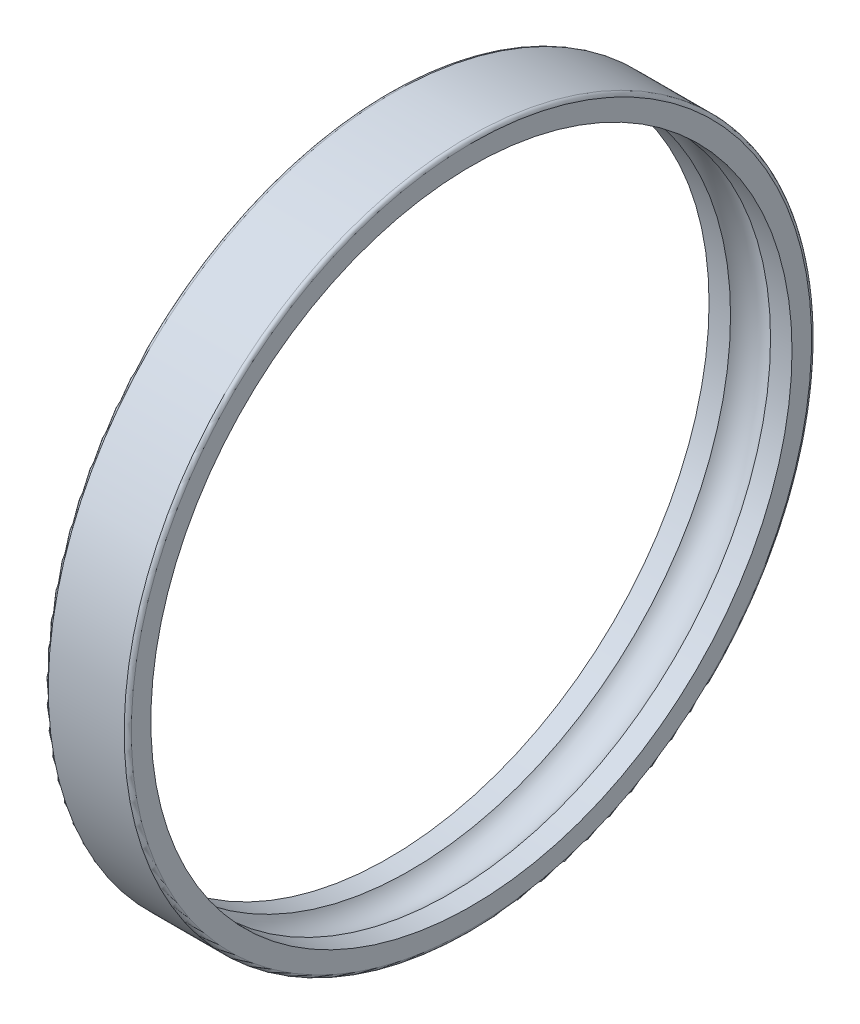
ISO-10303-21;
HEADER;
FILE_DESCRIPTION(('STEP AP214'),'2;1');
FILE_NAME('part.step','',(''),(''),'','','');
FILE_SCHEMA(('AUTOMOTIVE_DESIGN { 1 0 10303 214 1 1 1 1 }'));
ENDSEC;
DATA;
#1=APPLICATION_CONTEXT('core data for automotive mechanical design processes');
#2=APPLICATION_PROTOCOL_DEFINITION('international standard','automotive_design',2000,#1);
#3=PRODUCT_CONTEXT('',#1,'mechanical');
#4=PRODUCT('Part','Part','',(#3));
#5=PRODUCT_RELATED_PRODUCT_CATEGORY('part','',(#4));
#6=PRODUCT_DEFINITION_FORMATION('','',#4);
#7=PRODUCT_DEFINITION_CONTEXT('part definition',#1,'design');
#8=PRODUCT_DEFINITION('design','',#6,#7);
#9=PRODUCT_DEFINITION_SHAPE('','',#8);
#10=(LENGTH_UNIT() NAMED_UNIT(*) SI_UNIT(.MILLI.,.METRE.));
#11=(NAMED_UNIT(*) PLANE_ANGLE_UNIT() SI_UNIT($,.RADIAN.));
#12=(NAMED_UNIT(*) SI_UNIT($,.STERADIAN.) SOLID_ANGLE_UNIT());
#13=UNCERTAINTY_MEASURE_WITH_UNIT(LENGTH_MEASURE(1.E-05),#10,'distance_accuracy_value','');
#14=(GEOMETRIC_REPRESENTATION_CONTEXT(3) GLOBAL_UNCERTAINTY_ASSIGNED_CONTEXT((#13)) GLOBAL_UNIT_ASSIGNED_CONTEXT((#10,
#11,#12)) REPRESENTATION_CONTEXT('',''));
#15=CARTESIAN_POINT('',(0.,0.,0.));
#16=DIRECTION('',(0.,0.,1.));
#17=DIRECTION('',(1.,0.,0.));
#18=AXIS2_PLACEMENT_3D('',#15,#16,#17);
#19=CARTESIAN_POINT('',(3.5,0.,0.));
#20=DIRECTION('',(-1.,0.,0.));
#21=DIRECTION('',(0.,-1.,0.));
#22=AXIS2_PLACEMENT_3D('',#19,#20,#21);
#23=TOROIDAL_SURFACE('',#22,25.8,2.1);
#24=CARTESIAN_POINT('',(5.18745370306862,0.,0.));
#25=DIRECTION('',(1.,0.,0.));
#26=DIRECTION('',(0.,0.,-1.));
#27=AXIS2_PLACEMENT_3D('',#24,#25,#26);
#28=CIRCLE('',#27,27.05);
#29=CARTESIAN_POINT('',(5.18745370306862,0.,-27.05));
#30=VERTEX_POINT('',#29);
#31=EDGE_CURVE('E195',#30,#30,#28,.T.);
#32=ORIENTED_EDGE('',*,*,#31,.T.);
#33=EDGE_LOOP('',(#32));
#34=FACE_BOUND('',#33,.T.);
#35=CARTESIAN_POINT('',(1.81254629693138,0.,0.));
#36=DIRECTION('',(1.,0.,0.));
#37=DIRECTION('',(0.,0.,-1.));
#38=AXIS2_PLACEMENT_3D('',#35,#36,#37);
#39=CIRCLE('',#38,27.05);
#40=CARTESIAN_POINT('',(1.81254629693138,0.,-27.05));
#41=VERTEX_POINT('',#40);
#42=EDGE_CURVE('E198',#41,#41,#39,.F.);
#43=ORIENTED_EDGE('',*,*,#42,.T.);
#44=EDGE_LOOP('',(#43));
#45=FACE_BOUND('',#44,.T.);
#46=ADVANCED_FACE('F16',(#34,#45),#23,.F.);
#47=CARTESIAN_POINT('',(6.72,0.,0.));
#48=DIRECTION('',(1.,0.,0.));
#49=DIRECTION('',(0.,0.,-1.));
#50=AXIS2_PLACEMENT_3D('',#47,#48,#49);
#51=CYLINDRICAL_SURFACE('',#50,27.05);
#52=CARTESIAN_POINT('',(7.,0.,0.));
#53=DIRECTION('',(1.,0.,0.));
#54=DIRECTION('',(0.,0.,-1.));
#55=AXIS2_PLACEMENT_3D('',#52,#53,#54);
#56=CIRCLE('',#55,27.05);
#57=CARTESIAN_POINT('',(7.,0.,-27.05));
#58=VERTEX_POINT('',#57);
#59=EDGE_CURVE('E199',#58,#58,#56,.F.);
#60=ORIENTED_EDGE('',*,*,#59,.F.);
#61=EDGE_LOOP('',(#60));
#62=FACE_BOUND('',#61,.T.);
#63=ORIENTED_EDGE('',*,*,#31,.F.);
#64=EDGE_LOOP('',(#63));
#65=FACE_BOUND('',#64,.T.);
#66=ADVANCED_FACE('F170',(#62,#65),#51,.F.);
#67=CARTESIAN_POINT('',(1.18627314846569,0.,0.));
#68=DIRECTION('',(1.,0.,0.));
#69=DIRECTION('',(0.,0.,-1.));
#70=AXIS2_PLACEMENT_3D('',#67,#68,#69);
#71=CYLINDRICAL_SURFACE('',#70,27.05);
#72=ORIENTED_EDGE('',*,*,#42,.F.);
#73=EDGE_LOOP('',(#72));
#74=FACE_BOUND('',#73,.T.);
#75=CARTESIAN_POINT('',(0.,0.,0.));
#76=DIRECTION('',(1.,0.,0.));
#77=DIRECTION('',(0.,0.,-1.));
#78=AXIS2_PLACEMENT_3D('',#75,#76,#77);
#79=CIRCLE('',#78,27.05);
#80=CARTESIAN_POINT('',(0.,0.,-27.05));
#81=VERTEX_POINT('',#80);
#82=EDGE_CURVE('E52',#81,#81,#79,.T.);
#83=ORIENTED_EDGE('',*,*,#82,.F.);
#84=EDGE_LOOP('',(#83));
#85=FACE_BOUND('',#84,.T.);
#86=ADVANCED_FACE('F162',(#74,#85),#71,.F.);
#87=CARTESIAN_POINT('',(7.,0.,27.875));
#88=DIRECTION('',(1.,0.,0.));
#89=DIRECTION('',(0.,0.,-1.));
#90=AXIS2_PLACEMENT_3D('',#87,#88,#89);
#91=PLANE('',#90);
#92=ORIENTED_EDGE('',*,*,#59,.T.);
#93=EDGE_LOOP('',(#92));
#94=FACE_BOUND('',#93,.T.);
#95=CARTESIAN_POINT('',(7.,0.,0.));
#96=DIRECTION('',(-1.,0.,0.));
#97=DIRECTION('',(0.,-1.,0.));
#98=AXIS2_PLACEMENT_3D('',#95,#96,#97);
#99=CIRCLE('',#98,28.7);
#100=CARTESIAN_POINT('',(7.,-28.7,0.));
#101=VERTEX_POINT('',#100);
#102=CARTESIAN_POINT('',(7.,28.7,0.));
#103=VERTEX_POINT('',#102);
#104=EDGE_CURVE('E45',#101,#103,#99,.T.);
#105=ORIENTED_EDGE('',*,*,#104,.F.);
#106=CARTESIAN_POINT('',(7.,0.,0.));
#107=DIRECTION('',(-1.,0.,0.));
#108=DIRECTION('',(0.,1.,0.));
#109=AXIS2_PLACEMENT_3D('',#106,#107,#108);
#110=CIRCLE('',#109,28.7);
#111=EDGE_CURVE('E50',#103,#101,#110,.T.);
#112=ORIENTED_EDGE('',*,*,#111,.F.);
#113=EDGE_LOOP('',(#105,#112));
#114=FACE_BOUND('',#113,.T.);
#115=ADVANCED_FACE('F49',(#94,#114),#91,.T.);
#116=CARTESIAN_POINT('',(0.,0.,27.875));
#117=DIRECTION('',(-1.,0.,0.));
#118=DIRECTION('',(0.,0.,1.));
#119=AXIS2_PLACEMENT_3D('',#116,#117,#118);
#120=PLANE('',#119);
#121=ORIENTED_EDGE('',*,*,#82,.T.);
#122=EDGE_LOOP('',(#121));
#123=FACE_BOUND('',#122,.T.);
#124=CARTESIAN_POINT('',(0.,0.,0.));
#125=DIRECTION('',(1.,0.,0.));
#126=DIRECTION('',(0.,-1.,0.));
#127=AXIS2_PLACEMENT_3D('',#124,#125,#126);
#128=CIRCLE('',#127,28.7);
#129=CARTESIAN_POINT('',(0.,-28.7,0.));
#130=VERTEX_POINT('',#129);
#131=CARTESIAN_POINT('',(0.,28.7,0.));
#132=VERTEX_POINT('',#131);
#133=EDGE_CURVE('E36',#130,#132,#128,.T.);
#134=ORIENTED_EDGE('',*,*,#133,.F.);
#135=CARTESIAN_POINT('',(0.,0.,0.));
#136=DIRECTION('',(1.,0.,0.));
#137=DIRECTION('',(0.,1.,0.));
#138=AXIS2_PLACEMENT_3D('',#135,#136,#137);
#139=CIRCLE('',#138,28.7);
#140=EDGE_CURVE('E97',#132,#130,#139,.T.);
#141=ORIENTED_EDGE('',*,*,#140,.F.);
#142=EDGE_LOOP('',(#134,#141));
#143=FACE_BOUND('',#142,.T.);
#144=ADVANCED_FACE('F76',(#123,#143),#120,.T.);
#145=CARTESIAN_POINT('',(6.7,0.,0.));
#146=DIRECTION('',(-1.,0.,0.));
#147=DIRECTION('',(0.,-1.,0.));
#148=AXIS2_PLACEMENT_3D('',#145,#146,#147);
#149=TOROIDAL_SURFACE('',#148,28.7,0.300000000000001);
#150=CARTESIAN_POINT('',(6.7,0.,0.));
#151=DIRECTION('',(1.,0.,0.));
#152=DIRECTION('',(0.,0.,-1.));
#153=AXIS2_PLACEMENT_3D('',#150,#151,#152);
#154=CIRCLE('',#153,29.);
#155=CARTESIAN_POINT('',(6.7,0.,-29.));
#156=VERTEX_POINT('',#155);
#157=EDGE_CURVE('E28',#156,#156,#154,.F.);
#158=ORIENTED_EDGE('',*,*,#157,.F.);
#159=EDGE_LOOP('',(#158));
#160=FACE_BOUND('',#159,.T.);
#161=ORIENTED_EDGE('',*,*,#111,.T.);
#162=ORIENTED_EDGE('',*,*,#104,.T.);
#163=EDGE_LOOP('',(#161,#162));
#164=FACE_BOUND('',#163,.T.);
#165=ADVANCED_FACE('F55',(#160,#164),#149,.T.);
#166=CARTESIAN_POINT('',(0.300000000000002,0.,0.));
#167=DIRECTION('',(-1.,0.,0.));
#168=DIRECTION('',(0.,-1.,0.));
#169=AXIS2_PLACEMENT_3D('',#166,#167,#168);
#170=TOROIDAL_SURFACE('',#169,28.7,0.300000000000002);
#171=CARTESIAN_POINT('',(0.3,0.,0.));
#172=DIRECTION('',(1.,0.,0.));
#173=DIRECTION('',(0.,0.,-1.));
#174=AXIS2_PLACEMENT_3D('',#171,#172,#173);
#175=CIRCLE('',#174,29.);
#176=CARTESIAN_POINT('',(0.3,0.,-29.));
#177=VERTEX_POINT('',#176);
#178=EDGE_CURVE('E11',#177,#177,#175,.T.);
#179=ORIENTED_EDGE('',*,*,#178,.F.);
#180=EDGE_LOOP('',(#179));
#181=FACE_BOUND('',#180,.T.);
#182=ORIENTED_EDGE('',*,*,#140,.T.);
#183=ORIENTED_EDGE('',*,*,#133,.T.);
#184=EDGE_LOOP('',(#182,#183));
#185=FACE_BOUND('',#184,.T.);
#186=ADVANCED_FACE('F75',(#181,#185),#170,.T.);
#187=CARTESIAN_POINT('',(3.5,0.,0.));
#188=DIRECTION('',(1.,0.,0.));
#189=DIRECTION('',(0.,0.,-1.));
#190=AXIS2_PLACEMENT_3D('',#187,#188,#189);
#191=CYLINDRICAL_SURFACE('',#190,29.);
#192=ORIENTED_EDGE('',*,*,#157,.T.);
#193=EDGE_LOOP('',(#192));
#194=FACE_BOUND('',#193,.T.);
#195=ORIENTED_EDGE('',*,*,#178,.T.);
#196=EDGE_LOOP('',(#195));
#197=FACE_BOUND('',#196,.T.);
#198=ADVANCED_FACE('F117',(#194,#197),#191,.T.);
#199=CLOSED_SHELL('',(#46,#66,#86,#115,#144,#165,#186,#198));
#200=MANIFOLD_SOLID_BREP('B1',#199);
#201=ADVANCED_BREP_SHAPE_REPRESENTATION('',(#18,#200),#14);
#202=SHAPE_DEFINITION_REPRESENTATION(#9,#201);
ENDSEC;
END-ISO-10303-21;
